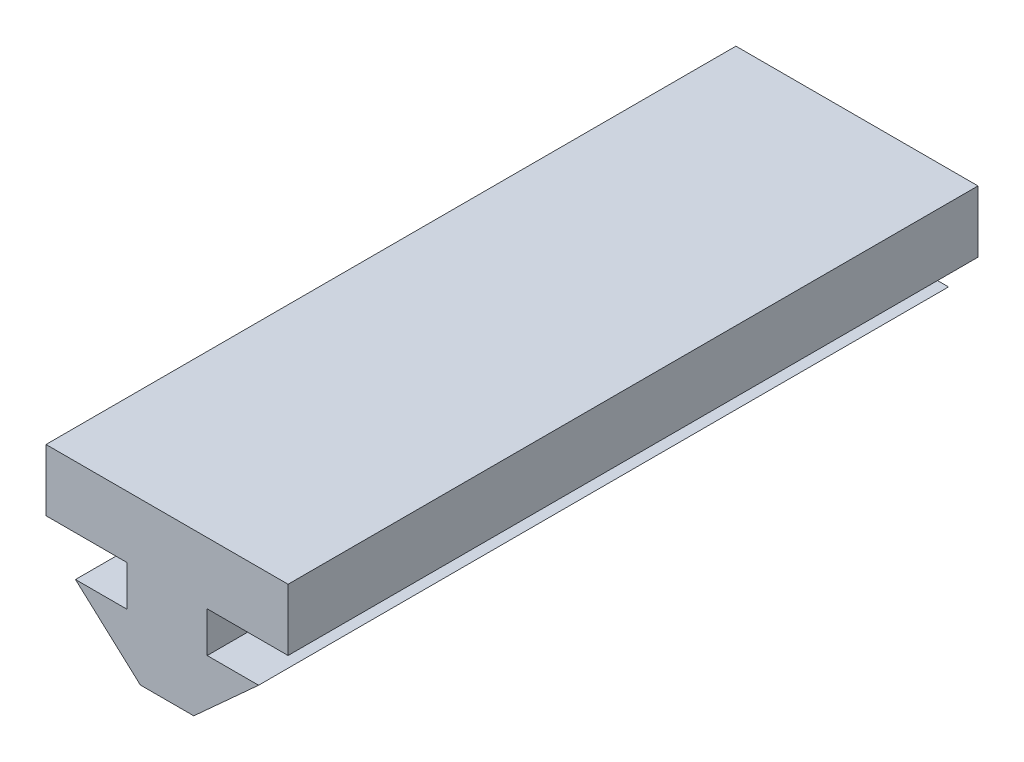
ISO-10303-21;
HEADER;
FILE_DESCRIPTION(('STEP AP214'),'2;1');
FILE_NAME('part.step','',(''),(''),'','','');
FILE_SCHEMA(('AUTOMOTIVE_DESIGN { 1 0 10303 214 1 1 1 1 }'));
ENDSEC;
DATA;
#1=APPLICATION_CONTEXT('core data for automotive mechanical design processes');
#2=APPLICATION_PROTOCOL_DEFINITION('international standard','automotive_design',2000,#1);
#3=PRODUCT_CONTEXT('',#1,'mechanical');
#4=PRODUCT('Part','Part','',(#3));
#5=PRODUCT_RELATED_PRODUCT_CATEGORY('part','',(#4));
#6=PRODUCT_DEFINITION_FORMATION('','',#4);
#7=PRODUCT_DEFINITION_CONTEXT('part definition',#1,'design');
#8=PRODUCT_DEFINITION('design','',#6,#7);
#9=PRODUCT_DEFINITION_SHAPE('','',#8);
#10=(LENGTH_UNIT() NAMED_UNIT(*) SI_UNIT(.MILLI.,.METRE.));
#11=(NAMED_UNIT(*) PLANE_ANGLE_UNIT() SI_UNIT($,.RADIAN.));
#12=(NAMED_UNIT(*) SI_UNIT($,.STERADIAN.) SOLID_ANGLE_UNIT());
#13=UNCERTAINTY_MEASURE_WITH_UNIT(LENGTH_MEASURE(1.E-05),#10,'distance_accuracy_value','');
#14=(GEOMETRIC_REPRESENTATION_CONTEXT(3) GLOBAL_UNCERTAINTY_ASSIGNED_CONTEXT((#13)) GLOBAL_UNIT_ASSIGNED_CONTEXT((#10,
#11,#12)) REPRESENTATION_CONTEXT('',''));
#15=CARTESIAN_POINT('',(0.,0.,0.));
#16=DIRECTION('',(0.,0.,1.));
#17=DIRECTION('',(1.,0.,0.));
#18=AXIS2_PLACEMENT_3D('',#15,#16,#17);
#19=CARTESIAN_POINT('',(-2.16399369011131,4.6482,215.9));
#20=DIRECTION('',(0.672549330730015,0.740052293918888,0.));
#21=DIRECTION('',(-0.740052293918888,0.672549330730016,0.));
#22=AXIS2_PLACEMENT_3D('',#19,#20,#21);
#23=PLANE('',#22);
#24=DIRECTION('',(0.,0.,1.));
#25=VECTOR('',#24,1.);
#26=CARTESIAN_POINT('',(-2.16399369011131,4.6482,215.9));
#27=LINE('',#26,#25);
#28=CARTESIAN_POINT('',(-2.16399369011131,4.6482,215.9));
#29=VERTEX_POINT('',#28);
#30=CARTESIAN_POINT('',(-2.16399369011131,4.6482,271.78));
#31=VERTEX_POINT('',#30);
#32=EDGE_CURVE('E150',#29,#31,#27,.T.);
#33=ORIENTED_EDGE('',*,*,#32,.T.);
#34=DIRECTION('',(-0.740052293918888,0.672549330730016,0.));
#35=VECTOR('',#34,1.);
#36=CARTESIAN_POINT('',(-2.16399369011131,4.6482,271.78));
#37=LINE('',#36,#35);
#38=CARTESIAN_POINT('',(-7.4168,9.42187801870126,271.78));
#39=VERTEX_POINT('',#38);
#40=EDGE_CURVE('E144',#31,#39,#37,.T.);
#41=ORIENTED_EDGE('',*,*,#40,.T.);
#42=DIRECTION('',(0.,0.,1.));
#43=VECTOR('',#42,1.);
#44=CARTESIAN_POINT('',(-7.4168,9.42187801870126,215.9));
#45=LINE('',#44,#43);
#46=CARTESIAN_POINT('',(-7.4168,9.42187801870126,215.9));
#47=VERTEX_POINT('',#46);
#48=EDGE_CURVE('E11',#47,#39,#45,.T.);
#49=ORIENTED_EDGE('',*,*,#48,.F.);
#50=DIRECTION('',(-0.740052293918888,0.672549330730016,0.));
#51=VECTOR('',#50,1.);
#52=CARTESIAN_POINT('',(-2.16399369011131,4.6482,215.9));
#53=LINE('',#52,#51);
#54=EDGE_CURVE('E179',#29,#47,#53,.T.);
#55=ORIENTED_EDGE('',*,*,#54,.F.);
#56=EDGE_LOOP('',(#33,#41,#49,#55));
#57=FACE_BOUND('',#56,.T.);
#58=ADVANCED_FACE('F42',(#57),#23,.F.);
#59=CARTESIAN_POINT('',(-7.4168,9.42187801870126,215.9));
#60=DIRECTION('',(0.,-1.,0.));
#61=DIRECTION('',(0.,0.,-1.));
#62=AXIS2_PLACEMENT_3D('',#59,#60,#61);
#63=PLANE('',#62);
#64=ORIENTED_EDGE('',*,*,#48,.T.);
#65=DIRECTION('',(1.,0.,0.));
#66=VECTOR('',#65,1.);
#67=CARTESIAN_POINT('',(-7.4168,9.42187801870126,271.78));
#68=LINE('',#67,#66);
#69=CARTESIAN_POINT('',(-3.2512,9.42187801870126,271.78));
#70=VERTEX_POINT('',#69);
#71=EDGE_CURVE('E134',#39,#70,#68,.T.);
#72=ORIENTED_EDGE('',*,*,#71,.T.);
#73=DIRECTION('',(0.,0.,1.));
#74=VECTOR('',#73,1.);
#75=CARTESIAN_POINT('',(-3.2512,9.42187801870126,215.9));
#76=LINE('',#75,#74);
#77=CARTESIAN_POINT('',(-3.2512,9.42187801870126,215.9));
#78=VERTEX_POINT('',#77);
#79=EDGE_CURVE('E49',#78,#70,#76,.T.);
#80=ORIENTED_EDGE('',*,*,#79,.F.);
#81=DIRECTION('',(1.,0.,0.));
#82=VECTOR('',#81,1.);
#83=CARTESIAN_POINT('',(-7.4168,9.42187801870126,215.9));
#84=LINE('',#83,#82);
#85=EDGE_CURVE('E135',#47,#78,#84,.T.);
#86=ORIENTED_EDGE('',*,*,#85,.F.);
#87=EDGE_LOOP('',(#64,#72,#80,#86));
#88=FACE_BOUND('',#87,.T.);
#89=ADVANCED_FACE('F132',(#88),#63,.F.);
#90=CARTESIAN_POINT('',(-3.2512,12.7,215.9));
#91=DIRECTION('',(-1.,0.,0.));
#92=DIRECTION('',(0.,0.,1.));
#93=AXIS2_PLACEMENT_3D('',#90,#91,#92);
#94=PLANE('',#93);
#95=ORIENTED_EDGE('',*,*,#79,.T.);
#96=DIRECTION('',(0.,1.,0.));
#97=VECTOR('',#96,1.);
#98=CARTESIAN_POINT('',(-3.2512,9.42187801870126,271.78));
#99=LINE('',#98,#97);
#100=CARTESIAN_POINT('',(-3.2512,12.7,271.78));
#101=VERTEX_POINT('',#100);
#102=EDGE_CURVE('E148',#70,#101,#99,.T.);
#103=ORIENTED_EDGE('',*,*,#102,.T.);
#104=DIRECTION('',(0.,0.,1.));
#105=VECTOR('',#104,1.);
#106=CARTESIAN_POINT('',(-3.2512,12.7,215.9));
#107=LINE('',#106,#105);
#108=CARTESIAN_POINT('',(-3.2512,12.7,215.9));
#109=VERTEX_POINT('',#108);
#110=EDGE_CURVE('E222',#109,#101,#107,.T.);
#111=ORIENTED_EDGE('',*,*,#110,.F.);
#112=DIRECTION('',(0.,1.,0.));
#113=VECTOR('',#112,1.);
#114=CARTESIAN_POINT('',(-3.2512,9.42187801870126,215.9));
#115=LINE('',#114,#113);
#116=EDGE_CURVE('E182',#78,#109,#115,.T.);
#117=ORIENTED_EDGE('',*,*,#116,.F.);
#118=EDGE_LOOP('',(#95,#103,#111,#117));
#119=FACE_BOUND('',#118,.T.);
#120=ADVANCED_FACE('F225',(#119),#94,.T.);
#121=CARTESIAN_POINT('',(-9.80370315240095,12.7,215.9));
#122=DIRECTION('',(0.,-1.,0.));
#123=DIRECTION('',(0.,0.,-1.));
#124=AXIS2_PLACEMENT_3D('',#121,#122,#123);
#125=PLANE('',#124);
#126=ORIENTED_EDGE('',*,*,#110,.T.);
#127=DIRECTION('',(1.,0.,0.));
#128=VECTOR('',#127,1.);
#129=CARTESIAN_POINT('',(-9.80370315240095,12.7,271.78));
#130=LINE('',#129,#128);
#131=CARTESIAN_POINT('',(-9.80370315240095,12.7,271.78));
#132=VERTEX_POINT('',#131);
#133=EDGE_CURVE('E154',#132,#101,#130,.T.);
#134=ORIENTED_EDGE('',*,*,#133,.F.);
#135=DIRECTION('',(0.,0.,1.));
#136=VECTOR('',#135,1.);
#137=CARTESIAN_POINT('',(-9.80370315240095,12.7,215.9));
#138=LINE('',#137,#136);
#139=CARTESIAN_POINT('',(-9.80370315240095,12.7,215.9));
#140=VERTEX_POINT('',#139);
#141=EDGE_CURVE('E220',#140,#132,#138,.T.);
#142=ORIENTED_EDGE('',*,*,#141,.F.);
#143=DIRECTION('',(1.,0.,0.));
#144=VECTOR('',#143,1.);
#145=CARTESIAN_POINT('',(-9.80370315240095,12.7,215.9));
#146=LINE('',#145,#144);
#147=EDGE_CURVE('E184',#140,#109,#146,.T.);
#148=ORIENTED_EDGE('',*,*,#147,.T.);
#149=EDGE_LOOP('',(#126,#134,#142,#148));
#150=FACE_BOUND('',#149,.T.);
#151=ADVANCED_FACE('F232',(#150),#125,.T.);
#152=CARTESIAN_POINT('',(-9.80370315240095,12.7,215.9));
#153=DIRECTION('',(1.,0.,0.));
#154=DIRECTION('',(0.,0.,-1.));
#155=AXIS2_PLACEMENT_3D('',#152,#153,#154);
#156=PLANE('',#155);
#157=ORIENTED_EDGE('',*,*,#141,.T.);
#158=DIRECTION('',(0.,1.,0.));
#159=VECTOR('',#158,1.);
#160=CARTESIAN_POINT('',(-9.80370315240095,12.7,271.78));
#161=LINE('',#160,#159);
#162=CARTESIAN_POINT('',(-9.80370315240095,17.7,271.78));
#163=VERTEX_POINT('',#162);
#164=EDGE_CURVE('E156',#132,#163,#161,.T.);
#165=ORIENTED_EDGE('',*,*,#164,.T.);
#166=DIRECTION('',(0.,0.,1.));
#167=VECTOR('',#166,1.);
#168=CARTESIAN_POINT('',(-9.80370315240095,17.7,215.9));
#169=LINE('',#168,#167);
#170=CARTESIAN_POINT('',(-9.80370315240095,17.7,215.9));
#171=VERTEX_POINT('',#170);
#172=EDGE_CURVE('E218',#171,#163,#169,.T.);
#173=ORIENTED_EDGE('',*,*,#172,.F.);
#174=DIRECTION('',(0.,1.,0.));
#175=VECTOR('',#174,1.);
#176=CARTESIAN_POINT('',(-9.80370315240095,12.7,215.9));
#177=LINE('',#176,#175);
#178=EDGE_CURVE('E187',#140,#171,#177,.T.);
#179=ORIENTED_EDGE('',*,*,#178,.F.);
#180=EDGE_LOOP('',(#157,#165,#173,#179));
#181=FACE_BOUND('',#180,.T.);
#182=ADVANCED_FACE('F236',(#181),#156,.F.);
#183=CARTESIAN_POINT('',(-9.80370315240095,17.7,215.9));
#184=DIRECTION('',(0.,-1.,0.));
#185=DIRECTION('',(0.,0.,-1.));
#186=AXIS2_PLACEMENT_3D('',#183,#184,#185);
#187=PLANE('',#186);
#188=ORIENTED_EDGE('',*,*,#172,.T.);
#189=DIRECTION('',(1.,0.,0.));
#190=VECTOR('',#189,1.);
#191=CARTESIAN_POINT('',(-9.80370315240095,17.7,271.78));
#192=LINE('',#191,#190);
#193=CARTESIAN_POINT('',(9.80370315240095,17.7,271.78));
#194=VERTEX_POINT('',#193);
#195=EDGE_CURVE('E159',#163,#194,#192,.T.);
#196=ORIENTED_EDGE('',*,*,#195,.T.);
#197=DIRECTION('',(0.,0.,1.));
#198=VECTOR('',#197,1.);
#199=CARTESIAN_POINT('',(9.80370315240095,17.7,215.9));
#200=LINE('',#199,#198);
#201=CARTESIAN_POINT('',(9.80370315240095,17.7,215.9));
#202=VERTEX_POINT('',#201);
#203=EDGE_CURVE('E216',#202,#194,#200,.T.);
#204=ORIENTED_EDGE('',*,*,#203,.F.);
#205=DIRECTION('',(1.,0.,0.));
#206=VECTOR('',#205,1.);
#207=CARTESIAN_POINT('',(-9.80370315240095,17.7,215.9));
#208=LINE('',#207,#206);
#209=EDGE_CURVE('E189',#171,#202,#208,.T.);
#210=ORIENTED_EDGE('',*,*,#209,.F.);
#211=EDGE_LOOP('',(#188,#196,#204,#210));
#212=FACE_BOUND('',#211,.T.);
#213=ADVANCED_FACE('F241',(#212),#187,.F.);
#214=CARTESIAN_POINT('',(9.80370315240095,12.7,215.9));
#215=DIRECTION('',(1.,0.,0.));
#216=DIRECTION('',(0.,0.,-1.));
#217=AXIS2_PLACEMENT_3D('',#214,#215,#216);
#218=PLANE('',#217);
#219=ORIENTED_EDGE('',*,*,#203,.T.);
#220=DIRECTION('',(0.,1.,0.));
#221=VECTOR('',#220,1.);
#222=CARTESIAN_POINT('',(9.80370315240095,12.7,271.78));
#223=LINE('',#222,#221);
#224=CARTESIAN_POINT('',(9.80370315240095,12.7,271.78));
#225=VERTEX_POINT('',#224);
#226=EDGE_CURVE('E162',#225,#194,#223,.T.);
#227=ORIENTED_EDGE('',*,*,#226,.F.);
#228=DIRECTION('',(0.,0.,1.));
#229=VECTOR('',#228,1.);
#230=CARTESIAN_POINT('',(9.80370315240095,12.7,215.9));
#231=LINE('',#230,#229);
#232=CARTESIAN_POINT('',(9.80370315240095,12.7,215.9));
#233=VERTEX_POINT('',#232);
#234=EDGE_CURVE('E214',#233,#225,#231,.T.);
#235=ORIENTED_EDGE('',*,*,#234,.F.);
#236=DIRECTION('',(0.,1.,0.));
#237=VECTOR('',#236,1.);
#238=CARTESIAN_POINT('',(9.80370315240095,12.7,215.9));
#239=LINE('',#238,#237);
#240=EDGE_CURVE('E191',#233,#202,#239,.T.);
#241=ORIENTED_EDGE('',*,*,#240,.T.);
#242=EDGE_LOOP('',(#219,#227,#235,#241));
#243=FACE_BOUND('',#242,.T.);
#244=ADVANCED_FACE('F283',(#243),#218,.T.);
#245=CARTESIAN_POINT('',(3.2512,12.7,215.9));
#246=DIRECTION('',(0.,-1.,0.));
#247=DIRECTION('',(0.,0.,-1.));
#248=AXIS2_PLACEMENT_3D('',#245,#246,#247);
#249=PLANE('',#248);
#250=ORIENTED_EDGE('',*,*,#234,.T.);
#251=DIRECTION('',(1.,0.,0.));
#252=VECTOR('',#251,1.);
#253=CARTESIAN_POINT('',(3.2512,12.7,271.78));
#254=LINE('',#253,#252);
#255=CARTESIAN_POINT('',(3.2512,12.7,271.78));
#256=VERTEX_POINT('',#255);
#257=EDGE_CURVE('E165',#256,#225,#254,.T.);
#258=ORIENTED_EDGE('',*,*,#257,.F.);
#259=DIRECTION('',(0.,0.,1.));
#260=VECTOR('',#259,1.);
#261=CARTESIAN_POINT('',(3.2512,12.7,215.9));
#262=LINE('',#261,#260);
#263=CARTESIAN_POINT('',(3.2512,12.7,215.9));
#264=VERTEX_POINT('',#263);
#265=EDGE_CURVE('E212',#264,#256,#262,.T.);
#266=ORIENTED_EDGE('',*,*,#265,.F.);
#267=DIRECTION('',(1.,0.,0.));
#268=VECTOR('',#267,1.);
#269=CARTESIAN_POINT('',(3.2512,12.7,215.9));
#270=LINE('',#269,#268);
#271=EDGE_CURVE('E194',#264,#233,#270,.T.);
#272=ORIENTED_EDGE('',*,*,#271,.T.);
#273=EDGE_LOOP('',(#250,#258,#266,#272));
#274=FACE_BOUND('',#273,.T.);
#275=ADVANCED_FACE('F247',(#274),#249,.T.);
#276=CARTESIAN_POINT('',(3.2512,9.42187801870127,215.9));
#277=DIRECTION('',(1.,0.,0.));
#278=DIRECTION('',(0.,0.,-1.));
#279=AXIS2_PLACEMENT_3D('',#276,#277,#278);
#280=PLANE('',#279);
#281=ORIENTED_EDGE('',*,*,#265,.T.);
#282=DIRECTION('',(0.,1.,0.));
#283=VECTOR('',#282,1.);
#284=CARTESIAN_POINT('',(3.2512,9.42187801870127,271.78));
#285=LINE('',#284,#283);
#286=CARTESIAN_POINT('',(3.2512,9.42187801870127,271.78));
#287=VERTEX_POINT('',#286);
#288=EDGE_CURVE('E168',#287,#256,#285,.T.);
#289=ORIENTED_EDGE('',*,*,#288,.F.);
#290=DIRECTION('',(0.,0.,1.));
#291=VECTOR('',#290,1.);
#292=CARTESIAN_POINT('',(3.2512,9.42187801870127,215.9));
#293=LINE('',#292,#291);
#294=CARTESIAN_POINT('',(3.2512,9.42187801870127,215.9));
#295=VERTEX_POINT('',#294);
#296=EDGE_CURVE('E210',#295,#287,#293,.T.);
#297=ORIENTED_EDGE('',*,*,#296,.F.);
#298=DIRECTION('',(0.,1.,0.));
#299=VECTOR('',#298,1.);
#300=CARTESIAN_POINT('',(3.2512,9.42187801870127,215.9));
#301=LINE('',#300,#299);
#302=EDGE_CURVE('E197',#295,#264,#301,.T.);
#303=ORIENTED_EDGE('',*,*,#302,.T.);
#304=EDGE_LOOP('',(#281,#289,#297,#303));
#305=FACE_BOUND('',#304,.T.);
#306=ADVANCED_FACE('F251',(#305),#280,.T.);
#307=CARTESIAN_POINT('',(7.4168,9.42187801870127,215.9));
#308=DIRECTION('',(0.,1.,0.));
#309=DIRECTION('',(0.,0.,1.));
#310=AXIS2_PLACEMENT_3D('',#307,#308,#309);
#311=PLANE('',#310);
#312=ORIENTED_EDGE('',*,*,#296,.T.);
#313=DIRECTION('',(-1.,0.,0.));
#314=VECTOR('',#313,1.);
#315=CARTESIAN_POINT('',(7.4168,9.42187801870127,271.78));
#316=LINE('',#315,#314);
#317=CARTESIAN_POINT('',(7.4168,9.42187801870127,271.78));
#318=VERTEX_POINT('',#317);
#319=EDGE_CURVE('E171',#318,#287,#316,.T.);
#320=ORIENTED_EDGE('',*,*,#319,.F.);
#321=DIRECTION('',(0.,0.,1.));
#322=VECTOR('',#321,1.);
#323=CARTESIAN_POINT('',(7.4168,9.42187801870127,215.9));
#324=LINE('',#323,#322);
#325=CARTESIAN_POINT('',(7.4168,9.42187801870127,215.9));
#326=VERTEX_POINT('',#325);
#327=EDGE_CURVE('E208',#326,#318,#324,.T.);
#328=ORIENTED_EDGE('',*,*,#327,.F.);
#329=DIRECTION('',(-1.,0.,0.));
#330=VECTOR('',#329,1.);
#331=CARTESIAN_POINT('',(7.4168,9.42187801870127,215.9));
#332=LINE('',#331,#330);
#333=EDGE_CURVE('E200',#326,#295,#332,.T.);
#334=ORIENTED_EDGE('',*,*,#333,.T.);
#335=EDGE_LOOP('',(#312,#320,#328,#334));
#336=FACE_BOUND('',#335,.T.);
#337=ADVANCED_FACE('F255',(#336),#311,.T.);
#338=CARTESIAN_POINT('',(2.16399369011136,4.6482,215.9));
#339=DIRECTION('',(0.672549330730019,-0.740052293918884,0.));
#340=DIRECTION('',(0.740052293918885,0.672549330730019,0.));
#341=AXIS2_PLACEMENT_3D('',#338,#339,#340);
#342=PLANE('',#341);
#343=ORIENTED_EDGE('',*,*,#327,.T.);
#344=DIRECTION('',(0.740052293918885,0.672549330730019,0.));
#345=VECTOR('',#344,1.);
#346=CARTESIAN_POINT('',(2.16399369011136,4.6482,271.78));
#347=LINE('',#346,#345);
#348=CARTESIAN_POINT('',(2.16399369011136,4.6482,271.78));
#349=VERTEX_POINT('',#348);
#350=EDGE_CURVE('E174',#349,#318,#347,.T.);
#351=ORIENTED_EDGE('',*,*,#350,.F.);
#352=DIRECTION('',(0.,0.,1.));
#353=VECTOR('',#352,1.);
#354=CARTESIAN_POINT('',(2.16399369011136,4.6482,215.9));
#355=LINE('',#354,#353);
#356=CARTESIAN_POINT('',(2.16399369011136,4.6482,215.9));
#357=VERTEX_POINT('',#356);
#358=EDGE_CURVE('E64',#357,#349,#355,.T.);
#359=ORIENTED_EDGE('',*,*,#358,.F.);
#360=DIRECTION('',(0.740052293918885,0.672549330730019,0.));
#361=VECTOR('',#360,1.);
#362=CARTESIAN_POINT('',(2.16399369011136,4.6482,215.9));
#363=LINE('',#362,#361);
#364=EDGE_CURVE('E203',#357,#326,#363,.T.);
#365=ORIENTED_EDGE('',*,*,#364,.T.);
#366=EDGE_LOOP('',(#343,#351,#359,#365));
#367=FACE_BOUND('',#366,.T.);
#368=ADVANCED_FACE('F257',(#367),#342,.T.);
#369=CARTESIAN_POINT('',(2.16399369011136,4.6482,215.9));
#370=DIRECTION('',(0.,1.,0.));
#371=DIRECTION('',(0.,0.,1.));
#372=AXIS2_PLACEMENT_3D('',#369,#370,#371);
#373=PLANE('',#372);
#374=ORIENTED_EDGE('',*,*,#358,.T.);
#375=DIRECTION('',(-1.,0.,0.));
#376=VECTOR('',#375,1.);
#377=CARTESIAN_POINT('',(2.16399369011136,4.6482,271.78));
#378=LINE('',#377,#376);
#379=EDGE_CURVE('E177',#349,#31,#378,.T.);
#380=ORIENTED_EDGE('',*,*,#379,.T.);
#381=ORIENTED_EDGE('',*,*,#32,.F.);
#382=DIRECTION('',(-1.,0.,0.));
#383=VECTOR('',#382,1.);
#384=CARTESIAN_POINT('',(2.16399369011136,4.6482,215.9));
#385=LINE('',#384,#383);
#386=EDGE_CURVE('E56',#357,#29,#385,.T.);
#387=ORIENTED_EDGE('',*,*,#386,.F.);
#388=EDGE_LOOP('',(#374,#380,#381,#387));
#389=FACE_BOUND('',#388,.T.);
#390=ADVANCED_FACE('F259',(#389),#373,.F.);
#391=CARTESIAN_POINT('',(0.,0.,215.9));
#392=DIRECTION('',(0.,0.,-1.));
#393=DIRECTION('',(-1.,0.,0.));
#394=AXIS2_PLACEMENT_3D('',#391,#392,#393);
#395=PLANE('',#394);
#396=ORIENTED_EDGE('',*,*,#54,.T.);
#397=ORIENTED_EDGE('',*,*,#85,.T.);
#398=ORIENTED_EDGE('',*,*,#116,.T.);
#399=ORIENTED_EDGE('',*,*,#147,.F.);
#400=ORIENTED_EDGE('',*,*,#178,.T.);
#401=ORIENTED_EDGE('',*,*,#209,.T.);
#402=ORIENTED_EDGE('',*,*,#240,.F.);
#403=ORIENTED_EDGE('',*,*,#271,.F.);
#404=ORIENTED_EDGE('',*,*,#302,.F.);
#405=ORIENTED_EDGE('',*,*,#333,.F.);
#406=ORIENTED_EDGE('',*,*,#364,.F.);
#407=ORIENTED_EDGE('',*,*,#386,.T.);
#408=EDGE_LOOP('',(#396,#397,#398,#399,#400,#401,#402,#403,#404,#405,#406,#407));
#409=FACE_BOUND('',#408,.T.);
#410=ADVANCED_FACE('F228',(#409),#395,.T.);
#411=CARTESIAN_POINT('',(0.,0.,271.78));
#412=DIRECTION('',(0.,0.,-1.));
#413=DIRECTION('',(-1.,0.,0.));
#414=AXIS2_PLACEMENT_3D('',#411,#412,#413);
#415=PLANE('',#414);
#416=ORIENTED_EDGE('',*,*,#40,.F.);
#417=ORIENTED_EDGE('',*,*,#379,.F.);
#418=ORIENTED_EDGE('',*,*,#350,.T.);
#419=ORIENTED_EDGE('',*,*,#319,.T.);
#420=ORIENTED_EDGE('',*,*,#288,.T.);
#421=ORIENTED_EDGE('',*,*,#257,.T.);
#422=ORIENTED_EDGE('',*,*,#226,.T.);
#423=ORIENTED_EDGE('',*,*,#195,.F.);
#424=ORIENTED_EDGE('',*,*,#164,.F.);
#425=ORIENTED_EDGE('',*,*,#133,.T.);
#426=ORIENTED_EDGE('',*,*,#102,.F.);
#427=ORIENTED_EDGE('',*,*,#71,.F.);
#428=EDGE_LOOP('',(#416,#417,#418,#419,#420,#421,#422,#423,#424,#425,#426,#427));
#429=FACE_BOUND('',#428,.T.);
#430=ADVANCED_FACE('F142',(#429),#415,.F.);
#431=CLOSED_SHELL('',(#58,#89,#120,#151,#182,#213,#244,#275,#306,#337,#368,#390,#410,#430));
#432=MANIFOLD_SOLID_BREP('B2',#431);
#433=ADVANCED_BREP_SHAPE_REPRESENTATION('',(#18,#432),#14);
#434=SHAPE_DEFINITION_REPRESENTATION(#9,#433);
ENDSEC;
END-ISO-10303-21;
